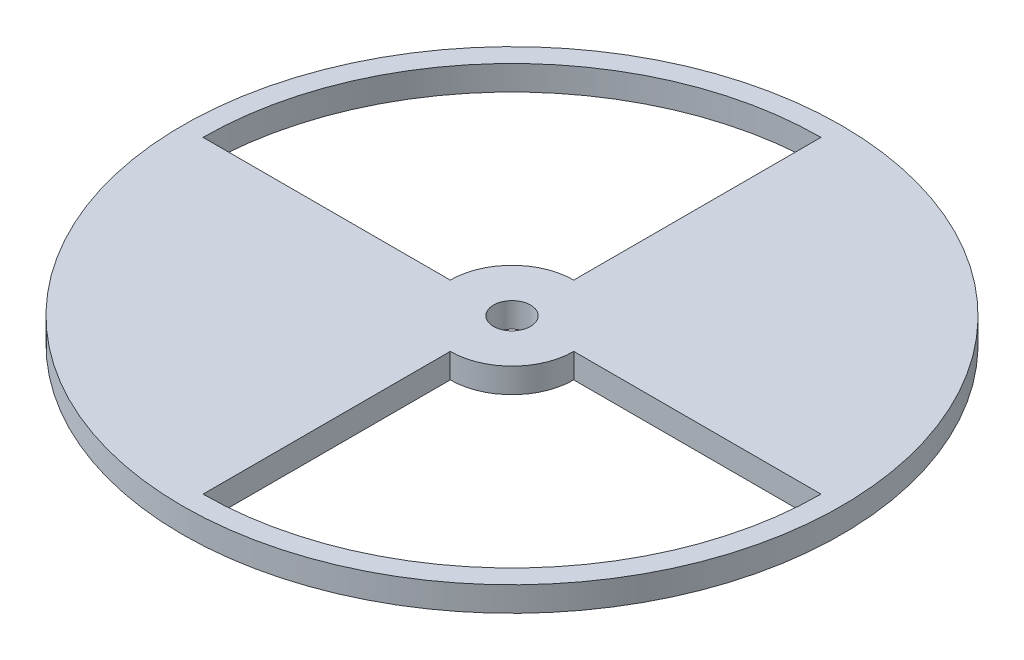
ISO-10303-21;
HEADER;
FILE_DESCRIPTION(('STEP AP214'),'2;1');
FILE_NAME('part.step','',(''),(''),'','','');
FILE_SCHEMA(('AUTOMOTIVE_DESIGN { 1 0 10303 214 1 1 1 1 }'));
ENDSEC;
DATA;
#1=APPLICATION_CONTEXT('core data for automotive mechanical design processes');
#2=APPLICATION_PROTOCOL_DEFINITION('international standard','automotive_design',2000,#1);
#3=PRODUCT_CONTEXT('',#1,'mechanical');
#4=PRODUCT('Part','Part','',(#3));
#5=PRODUCT_RELATED_PRODUCT_CATEGORY('part','',(#4));
#6=PRODUCT_DEFINITION_FORMATION('','',#4);
#7=PRODUCT_DEFINITION_CONTEXT('part definition',#1,'design');
#8=PRODUCT_DEFINITION('design','',#6,#7);
#9=PRODUCT_DEFINITION_SHAPE('','',#8);
#10=(LENGTH_UNIT() NAMED_UNIT(*) SI_UNIT(.MILLI.,.METRE.));
#11=(NAMED_UNIT(*) PLANE_ANGLE_UNIT() SI_UNIT($,.RADIAN.));
#12=(NAMED_UNIT(*) SI_UNIT($,.STERADIAN.) SOLID_ANGLE_UNIT());
#13=UNCERTAINTY_MEASURE_WITH_UNIT(LENGTH_MEASURE(1.E-05),#10,'distance_accuracy_value','');
#14=(GEOMETRIC_REPRESENTATION_CONTEXT(3) GLOBAL_UNCERTAINTY_ASSIGNED_CONTEXT((#13)) GLOBAL_UNIT_ASSIGNED_CONTEXT((#10,
#11,#12)) REPRESENTATION_CONTEXT('',''));
#15=CARTESIAN_POINT('',(0.,0.,0.));
#16=DIRECTION('',(0.,0.,1.));
#17=DIRECTION('',(1.,0.,0.));
#18=AXIS2_PLACEMENT_3D('',#15,#16,#17);
#19=CARTESIAN_POINT('',(0.,3.,0.));
#20=DIRECTION('',(0.,1.,0.));
#21=DIRECTION('',(0.,0.,1.));
#22=AXIS2_PLACEMENT_3D('',#19,#20,#21);
#23=PLANE('',#22);
#24=CARTESIAN_POINT('',(0.,3.,0.));
#25=DIRECTION('',(0.,-1.,0.));
#26=DIRECTION('',(0.,0.,1.));
#27=AXIS2_PLACEMENT_3D('',#24,#25,#26);
#28=CIRCLE('',#27,7.5);
#29=CARTESIAN_POINT('',(-7.5,3.,0.));
#30=VERTEX_POINT('',#29);
#31=CARTESIAN_POINT('',(0.,3.,-7.5));
#32=VERTEX_POINT('',#31);
#33=EDGE_CURVE('E54',#30,#32,#28,.T.);
#34=ORIENTED_EDGE('',*,*,#33,.F.);
#35=DIRECTION('',(1.,0.,0.));
#36=VECTOR('',#35,1.);
#37=CARTESIAN_POINT('',(-37.5,3.,0.));
#38=LINE('',#37,#36);
#39=CARTESIAN_POINT('',(-37.5,3.,0.));
#40=VERTEX_POINT('',#39);
#41=EDGE_CURVE('E111',#40,#30,#38,.T.);
#42=ORIENTED_EDGE('',*,*,#41,.F.);
#43=CARTESIAN_POINT('',(0.,3.,0.));
#44=DIRECTION('',(0.,1.,0.));
#45=DIRECTION('',(0.,0.,1.));
#46=AXIS2_PLACEMENT_3D('',#43,#44,#45);
#47=CIRCLE('',#46,37.5);
#48=CARTESIAN_POINT('',(0.,3.,-37.5));
#49=VERTEX_POINT('',#48);
#50=EDGE_CURVE('E303',#49,#40,#47,.T.);
#51=ORIENTED_EDGE('',*,*,#50,.F.);
#52=DIRECTION('',(0.,0.,-1.));
#53=VECTOR('',#52,1.);
#54=CARTESIAN_POINT('',(0.,3.,-37.5));
#55=LINE('',#54,#53);
#56=EDGE_CURVE('E306',#32,#49,#55,.T.);
#57=ORIENTED_EDGE('',*,*,#56,.F.);
#58=EDGE_LOOP('',(#34,#42,#51,#57));
#59=FACE_BOUND('',#58,.T.);
#60=CARTESIAN_POINT('',(0.,3.,0.));
#61=DIRECTION('',(0.,-1.,0.));
#62=DIRECTION('',(0.,0.,1.));
#63=AXIS2_PLACEMENT_3D('',#60,#61,#62);
#64=CIRCLE('',#63,7.5);
#65=CARTESIAN_POINT('',(7.5,3.,0.));
#66=VERTEX_POINT('',#65);
#67=CARTESIAN_POINT('',(0.,3.,7.5));
#68=VERTEX_POINT('',#67);
#69=EDGE_CURVE('E62',#66,#68,#64,.T.);
#70=ORIENTED_EDGE('',*,*,#69,.F.);
#71=DIRECTION('',(-1.,0.,0.));
#72=VECTOR('',#71,1.);
#73=CARTESIAN_POINT('',(7.5,3.,0.));
#74=LINE('',#73,#72);
#75=CARTESIAN_POINT('',(37.5,3.,0.));
#76=VERTEX_POINT('',#75);
#77=EDGE_CURVE('E145',#76,#66,#74,.T.);
#78=ORIENTED_EDGE('',*,*,#77,.F.);
#79=CARTESIAN_POINT('',(0.,3.,0.));
#80=DIRECTION('',(0.,1.,0.));
#81=DIRECTION('',(0.,0.,1.));
#82=AXIS2_PLACEMENT_3D('',#79,#80,#81);
#83=CIRCLE('',#82,37.5);
#84=CARTESIAN_POINT('',(0.,3.,37.5));
#85=VERTEX_POINT('',#84);
#86=EDGE_CURVE('E142',#85,#76,#83,.T.);
#87=ORIENTED_EDGE('',*,*,#86,.F.);
#88=DIRECTION('',(0.,0.,1.));
#89=VECTOR('',#88,1.);
#90=CARTESIAN_POINT('',(0.,3.,7.5));
#91=LINE('',#90,#89);
#92=EDGE_CURVE('E139',#68,#85,#91,.T.);
#93=ORIENTED_EDGE('',*,*,#92,.F.);
#94=EDGE_LOOP('',(#70,#78,#87,#93));
#95=FACE_BOUND('',#94,.T.);
#96=CARTESIAN_POINT('',(0.,3.,0.));
#97=DIRECTION('',(0.,1.,0.));
#98=DIRECTION('',(0.,0.,1.));
#99=AXIS2_PLACEMENT_3D('',#96,#97,#98);
#100=CIRCLE('',#99,40.);
#101=CARTESIAN_POINT('',(0.,3.,40.));
#102=VERTEX_POINT('',#101);
#103=EDGE_CURVE('E11',#102,#102,#100,.T.);
#104=ORIENTED_EDGE('',*,*,#103,.T.);
#105=EDGE_LOOP('',(#104));
#106=FACE_BOUND('',#105,.T.);
#107=CARTESIAN_POINT('',(0.,3.,0.));
#108=DIRECTION('',(0.,1.,0.));
#109=DIRECTION('',(0.,0.,1.));
#110=AXIS2_PLACEMENT_3D('',#107,#108,#109);
#111=CIRCLE('',#110,2.25);
#112=CARTESIAN_POINT('',(0.,3.,2.25));
#113=VERTEX_POINT('',#112);
#114=EDGE_CURVE('E160',#113,#113,#111,.T.);
#115=ORIENTED_EDGE('',*,*,#114,.F.);
#116=EDGE_LOOP('',(#115));
#117=FACE_BOUND('',#116,.T.);
#118=ADVANCED_FACE('F39',(#59,#95,#106,#117),#23,.T.);
#119=CARTESIAN_POINT('',(0.,0.,0.));
#120=DIRECTION('',(0.,1.,0.));
#121=DIRECTION('',(0.,0.,1.));
#122=AXIS2_PLACEMENT_3D('',#119,#120,#121);
#123=PLANE('',#122);
#124=DIRECTION('',(-1.,0.,0.));
#125=VECTOR('',#124,1.);
#126=CARTESIAN_POINT('',(-37.5,0.,0.));
#127=LINE('',#126,#125);
#128=CARTESIAN_POINT('',(-7.5,0.,0.));
#129=VERTEX_POINT('',#128);
#130=CARTESIAN_POINT('',(-37.5,0.,0.));
#131=VERTEX_POINT('',#130);
#132=EDGE_CURVE('E108',#129,#131,#127,.T.);
#133=ORIENTED_EDGE('',*,*,#132,.F.);
#134=CARTESIAN_POINT('',(0.,0.,0.));
#135=DIRECTION('',(0.,1.,0.));
#136=DIRECTION('',(0.,0.,1.));
#137=AXIS2_PLACEMENT_3D('',#134,#135,#136);
#138=CIRCLE('',#137,7.5);
#139=CARTESIAN_POINT('',(0.,0.,-7.5));
#140=VERTEX_POINT('',#139);
#141=EDGE_CURVE('E116',#140,#129,#138,.T.);
#142=ORIENTED_EDGE('',*,*,#141,.F.);
#143=DIRECTION('',(0.,0.,1.));
#144=VECTOR('',#143,1.);
#145=CARTESIAN_POINT('',(0.,0.,-37.5));
#146=LINE('',#145,#144);
#147=CARTESIAN_POINT('',(0.,0.,-37.5));
#148=VERTEX_POINT('',#147);
#149=EDGE_CURVE('E113',#148,#140,#146,.T.);
#150=ORIENTED_EDGE('',*,*,#149,.F.);
#151=CARTESIAN_POINT('',(0.,0.,0.));
#152=DIRECTION('',(0.,1.,0.));
#153=DIRECTION('',(0.,0.,1.));
#154=AXIS2_PLACEMENT_3D('',#151,#152,#153);
#155=CIRCLE('',#154,37.5);
#156=EDGE_CURVE('E125',#131,#148,#155,.F.);
#157=ORIENTED_EDGE('',*,*,#156,.F.);
#158=EDGE_LOOP('',(#133,#142,#150,#157));
#159=FACE_BOUND('',#158,.T.);
#160=DIRECTION('',(1.,0.,0.));
#161=VECTOR('',#160,1.);
#162=CARTESIAN_POINT('',(7.5,0.,0.));
#163=LINE('',#162,#161);
#164=CARTESIAN_POINT('',(7.5,0.,0.));
#165=VERTEX_POINT('',#164);
#166=CARTESIAN_POINT('',(37.5,0.,0.));
#167=VERTEX_POINT('',#166);
#168=EDGE_CURVE('E132',#165,#167,#163,.T.);
#169=ORIENTED_EDGE('',*,*,#168,.F.);
#170=CARTESIAN_POINT('',(0.,0.,0.));
#171=DIRECTION('',(0.,1.,0.));
#172=DIRECTION('',(0.,0.,1.));
#173=AXIS2_PLACEMENT_3D('',#170,#171,#172);
#174=CIRCLE('',#173,7.5);
#175=CARTESIAN_POINT('',(0.,0.,7.5));
#176=VERTEX_POINT('',#175);
#177=EDGE_CURVE('E135',#176,#165,#174,.T.);
#178=ORIENTED_EDGE('',*,*,#177,.F.);
#179=DIRECTION('',(0.,0.,-1.));
#180=VECTOR('',#179,1.);
#181=CARTESIAN_POINT('',(0.,0.,7.5));
#182=LINE('',#181,#180);
#183=CARTESIAN_POINT('',(0.,0.,37.5));
#184=VERTEX_POINT('',#183);
#185=EDGE_CURVE('E151',#184,#176,#182,.T.);
#186=ORIENTED_EDGE('',*,*,#185,.F.);
#187=CARTESIAN_POINT('',(0.,0.,0.));
#188=DIRECTION('',(0.,1.,0.));
#189=DIRECTION('',(0.,0.,1.));
#190=AXIS2_PLACEMENT_3D('',#187,#188,#189);
#191=CIRCLE('',#190,37.5);
#192=EDGE_CURVE('E127',#167,#184,#191,.F.);
#193=ORIENTED_EDGE('',*,*,#192,.F.);
#194=EDGE_LOOP('',(#169,#178,#186,#193));
#195=FACE_BOUND('',#194,.T.);
#196=CARTESIAN_POINT('',(0.,0.,0.));
#197=DIRECTION('',(0.,1.,0.));
#198=DIRECTION('',(0.,0.,1.));
#199=AXIS2_PLACEMENT_3D('',#196,#197,#198);
#200=CIRCLE('',#199,40.);
#201=CARTESIAN_POINT('',(0.,0.,40.));
#202=VERTEX_POINT('',#201);
#203=EDGE_CURVE('E43',#202,#202,#200,.T.);
#204=ORIENTED_EDGE('',*,*,#203,.F.);
#205=EDGE_LOOP('',(#204));
#206=FACE_BOUND('',#205,.T.);
#207=CARTESIAN_POINT('',(0.,0.,0.));
#208=DIRECTION('',(0.,1.,0.));
#209=DIRECTION('',(0.,0.,1.));
#210=AXIS2_PLACEMENT_3D('',#207,#208,#209);
#211=CIRCLE('',#210,2.25);
#212=CARTESIAN_POINT('',(0.,0.,2.25));
#213=VERTEX_POINT('',#212);
#214=EDGE_CURVE('E159',#213,#213,#211,.T.);
#215=ORIENTED_EDGE('',*,*,#214,.T.);
#216=EDGE_LOOP('',(#215));
#217=FACE_BOUND('',#216,.T.);
#218=ADVANCED_FACE('F123',(#159,#195,#206,#217),#123,.F.);
#219=CARTESIAN_POINT('',(0.,3.,0.));
#220=DIRECTION('',(0.,-1.,0.));
#221=DIRECTION('',(0.,0.,-1.));
#222=AXIS2_PLACEMENT_3D('',#219,#220,#221);
#223=CYLINDRICAL_SURFACE('',#222,40.);
#224=ORIENTED_EDGE('',*,*,#103,.F.);
#225=EDGE_LOOP('',(#224));
#226=FACE_BOUND('',#225,.T.);
#227=ORIENTED_EDGE('',*,*,#203,.T.);
#228=EDGE_LOOP('',(#227));
#229=FACE_BOUND('',#228,.T.);
#230=ADVANCED_FACE('F41',(#226,#229),#223,.T.);
#231=CARTESIAN_POINT('',(0.,3.,0.));
#232=DIRECTION('',(0.,-1.,0.));
#233=DIRECTION('',(0.,0.,-1.));
#234=AXIS2_PLACEMENT_3D('',#231,#232,#233);
#235=CYLINDRICAL_SURFACE('',#234,2.25);
#236=ORIENTED_EDGE('',*,*,#114,.T.);
#237=EDGE_LOOP('',(#236));
#238=FACE_BOUND('',#237,.T.);
#239=ORIENTED_EDGE('',*,*,#214,.F.);
#240=EDGE_LOOP('',(#239));
#241=FACE_BOUND('',#240,.T.);
#242=ADVANCED_FACE('F167',(#238,#241),#235,.F.);
#243=CARTESIAN_POINT('',(0.,-0.00100000000000013,0.));
#244=DIRECTION('',(0.,1.,0.));
#245=DIRECTION('',(0.,0.,1.));
#246=AXIS2_PLACEMENT_3D('',#243,#244,#245);
#247=CYLINDRICAL_SURFACE('',#246,7.5);
#248=ORIENTED_EDGE('',*,*,#177,.T.);
#249=DIRECTION('',(0.,1.,0.));
#250=VECTOR('',#249,1.);
#251=CARTESIAN_POINT('',(7.5,-0.00100000000000013,0.));
#252=LINE('',#251,#250);
#253=EDGE_CURVE('E149',#165,#66,#252,.T.);
#254=ORIENTED_EDGE('',*,*,#253,.T.);
#255=ORIENTED_EDGE('',*,*,#69,.T.);
#256=DIRECTION('',(0.,1.,0.));
#257=VECTOR('',#256,1.);
#258=CARTESIAN_POINT('',(0.,-0.00100000000000013,7.5));
#259=LINE('',#258,#257);
#260=EDGE_CURVE('E148',#176,#68,#259,.T.);
#261=ORIENTED_EDGE('',*,*,#260,.F.);
#262=EDGE_LOOP('',(#248,#254,#255,#261));
#263=FACE_BOUND('',#262,.T.);
#264=ADVANCED_FACE('F169',(#263),#247,.T.);
#265=CARTESIAN_POINT('',(7.5,-0.00100000000000013,0.));
#266=DIRECTION('',(0.,0.,-1.));
#267=DIRECTION('',(-1.,0.,0.));
#268=AXIS2_PLACEMENT_3D('',#265,#266,#267);
#269=PLANE('',#268);
#270=ORIENTED_EDGE('',*,*,#168,.T.);
#271=DIRECTION('',(0.,1.,0.));
#272=VECTOR('',#271,1.);
#273=CARTESIAN_POINT('',(37.5,-0.00100000000000013,0.));
#274=LINE('',#273,#272);
#275=EDGE_CURVE('E152',#167,#76,#274,.T.);
#276=ORIENTED_EDGE('',*,*,#275,.T.);
#277=ORIENTED_EDGE('',*,*,#77,.T.);
#278=ORIENTED_EDGE('',*,*,#253,.F.);
#279=EDGE_LOOP('',(#270,#276,#277,#278));
#280=FACE_BOUND('',#279,.T.);
#281=ADVANCED_FACE('F177',(#280),#269,.F.);
#282=CARTESIAN_POINT('',(0.,-0.00100000000000013,0.));
#283=DIRECTION('',(0.,1.,0.));
#284=DIRECTION('',(0.,0.,1.));
#285=AXIS2_PLACEMENT_3D('',#282,#283,#284);
#286=CYLINDRICAL_SURFACE('',#285,37.5);
#287=ORIENTED_EDGE('',*,*,#192,.T.);
#288=DIRECTION('',(0.,1.,0.));
#289=VECTOR('',#288,1.);
#290=CARTESIAN_POINT('',(0.,-0.00100000000000013,37.5));
#291=LINE('',#290,#289);
#292=EDGE_CURVE('E154',#184,#85,#291,.T.);
#293=ORIENTED_EDGE('',*,*,#292,.T.);
#294=ORIENTED_EDGE('',*,*,#86,.T.);
#295=ORIENTED_EDGE('',*,*,#275,.F.);
#296=EDGE_LOOP('',(#287,#293,#294,#295));
#297=FACE_BOUND('',#296,.T.);
#298=ADVANCED_FACE('F207',(#297),#286,.F.);
#299=CARTESIAN_POINT('',(0.,-0.00100000000000013,7.5));
#300=DIRECTION('',(-1.,0.,0.));
#301=DIRECTION('',(0.,0.,1.));
#302=AXIS2_PLACEMENT_3D('',#299,#300,#301);
#303=PLANE('',#302);
#304=ORIENTED_EDGE('',*,*,#185,.T.);
#305=ORIENTED_EDGE('',*,*,#260,.T.);
#306=ORIENTED_EDGE('',*,*,#92,.T.);
#307=ORIENTED_EDGE('',*,*,#292,.F.);
#308=EDGE_LOOP('',(#304,#305,#306,#307));
#309=FACE_BOUND('',#308,.T.);
#310=ADVANCED_FACE('F200',(#309),#303,.F.);
#311=CARTESIAN_POINT('',(0.,-0.00100000000000013,0.));
#312=DIRECTION('',(0.,1.,0.));
#313=DIRECTION('',(0.,0.,1.));
#314=AXIS2_PLACEMENT_3D('',#311,#312,#313);
#315=CYLINDRICAL_SURFACE('',#314,7.5);
#316=ORIENTED_EDGE('',*,*,#141,.T.);
#317=DIRECTION('',(0.,1.,0.));
#318=VECTOR('',#317,1.);
#319=CARTESIAN_POINT('',(-7.5,-0.00100000000000013,0.));
#320=LINE('',#319,#318);
#321=EDGE_CURVE('E104',#129,#30,#320,.T.);
#322=ORIENTED_EDGE('',*,*,#321,.T.);
#323=ORIENTED_EDGE('',*,*,#33,.T.);
#324=DIRECTION('',(0.,1.,0.));
#325=VECTOR('',#324,1.);
#326=CARTESIAN_POINT('',(0.,-0.00100000000000013,-7.5));
#327=LINE('',#326,#325);
#328=EDGE_CURVE('E118',#140,#32,#327,.T.);
#329=ORIENTED_EDGE('',*,*,#328,.F.);
#330=EDGE_LOOP('',(#316,#322,#323,#329));
#331=FACE_BOUND('',#330,.T.);
#332=ADVANCED_FACE('F117',(#331),#315,.T.);
#333=CARTESIAN_POINT('',(-37.5,-0.00100000000000013,0.));
#334=DIRECTION('',(0.,0.,1.));
#335=DIRECTION('',(1.,0.,0.));
#336=AXIS2_PLACEMENT_3D('',#333,#334,#335);
#337=PLANE('',#336);
#338=ORIENTED_EDGE('',*,*,#132,.T.);
#339=DIRECTION('',(0.,1.,0.));
#340=VECTOR('',#339,1.);
#341=CARTESIAN_POINT('',(-37.5,-0.00100000000000013,0.));
#342=LINE('',#341,#340);
#343=EDGE_CURVE('E112',#131,#40,#342,.T.);
#344=ORIENTED_EDGE('',*,*,#343,.T.);
#345=ORIENTED_EDGE('',*,*,#41,.T.);
#346=ORIENTED_EDGE('',*,*,#321,.F.);
#347=EDGE_LOOP('',(#338,#344,#345,#346));
#348=FACE_BOUND('',#347,.T.);
#349=ADVANCED_FACE('F106',(#348),#337,.F.);
#350=CARTESIAN_POINT('',(0.,-0.00100000000000013,0.));
#351=DIRECTION('',(0.,1.,0.));
#352=DIRECTION('',(0.,0.,1.));
#353=AXIS2_PLACEMENT_3D('',#350,#351,#352);
#354=CYLINDRICAL_SURFACE('',#353,37.5);
#355=ORIENTED_EDGE('',*,*,#156,.T.);
#356=DIRECTION('',(0.,1.,0.));
#357=VECTOR('',#356,1.);
#358=CARTESIAN_POINT('',(0.,-0.00100000000000013,-37.5));
#359=LINE('',#358,#357);
#360=EDGE_CURVE('E296',#148,#49,#359,.T.);
#361=ORIENTED_EDGE('',*,*,#360,.T.);
#362=ORIENTED_EDGE('',*,*,#50,.T.);
#363=ORIENTED_EDGE('',*,*,#343,.F.);
#364=EDGE_LOOP('',(#355,#361,#362,#363));
#365=FACE_BOUND('',#364,.T.);
#366=ADVANCED_FACE('F219',(#365),#354,.F.);
#367=CARTESIAN_POINT('',(0.,-0.00100000000000013,-37.5));
#368=DIRECTION('',(1.,0.,0.));
#369=DIRECTION('',(0.,0.,-1.));
#370=AXIS2_PLACEMENT_3D('',#367,#368,#369);
#371=PLANE('',#370);
#372=ORIENTED_EDGE('',*,*,#149,.T.);
#373=ORIENTED_EDGE('',*,*,#328,.T.);
#374=ORIENTED_EDGE('',*,*,#56,.T.);
#375=ORIENTED_EDGE('',*,*,#360,.F.);
#376=EDGE_LOOP('',(#372,#373,#374,#375));
#377=FACE_BOUND('',#376,.T.);
#378=ADVANCED_FACE('F222',(#377),#371,.F.);
#379=CLOSED_SHELL('',(#118,#218,#230,#242,#264,#281,#298,#310,#332,#349,#366,#378));
#380=MANIFOLD_SOLID_BREP('B2',#379);
#381=ADVANCED_BREP_SHAPE_REPRESENTATION('',(#18,#380),#14);
#382=SHAPE_DEFINITION_REPRESENTATION(#9,#381);
ENDSEC;
END-ISO-10303-21;
